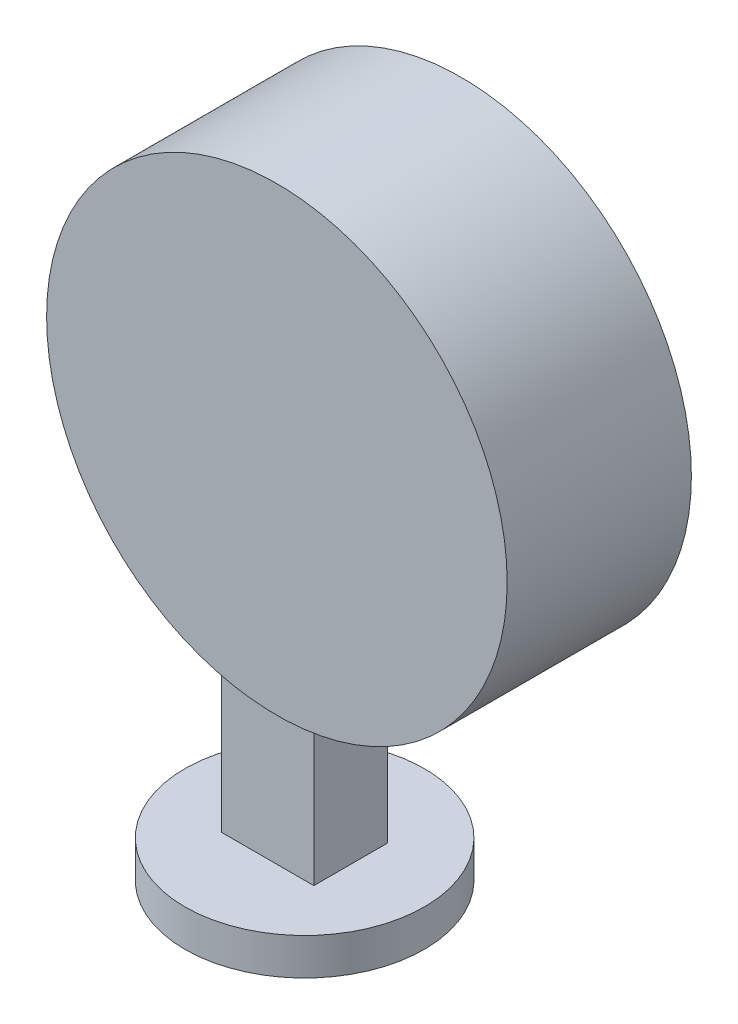
ISO-10303-21;
HEADER;
FILE_DESCRIPTION(('STEP AP214'),'2;1');
FILE_NAME('part.step','',(''),(''),'','','');
FILE_SCHEMA(('AUTOMOTIVE_DESIGN { 1 0 10303 214 1 1 1 1 }'));
ENDSEC;
DATA;
#1=APPLICATION_CONTEXT('core data for automotive mechanical design processes');
#2=APPLICATION_PROTOCOL_DEFINITION('international standard','automotive_design',2000,#1);
#3=PRODUCT_CONTEXT('',#1,'mechanical');
#4=PRODUCT('Part','Part','',(#3));
#5=PRODUCT_RELATED_PRODUCT_CATEGORY('part','',(#4));
#6=PRODUCT_DEFINITION_FORMATION('','',#4);
#7=PRODUCT_DEFINITION_CONTEXT('part definition',#1,'design');
#8=PRODUCT_DEFINITION('design','',#6,#7);
#9=PRODUCT_DEFINITION_SHAPE('','',#8);
#10=(LENGTH_UNIT() NAMED_UNIT(*) SI_UNIT(.MILLI.,.METRE.));
#11=(NAMED_UNIT(*) PLANE_ANGLE_UNIT() SI_UNIT($,.RADIAN.));
#12=(NAMED_UNIT(*) SI_UNIT($,.STERADIAN.) SOLID_ANGLE_UNIT());
#13=UNCERTAINTY_MEASURE_WITH_UNIT(LENGTH_MEASURE(1.E-05),#10,'distance_accuracy_value','');
#14=(GEOMETRIC_REPRESENTATION_CONTEXT(3) GLOBAL_UNCERTAINTY_ASSIGNED_CONTEXT((#13)) GLOBAL_UNIT_ASSIGNED_CONTEXT((#10,
#11,#12)) REPRESENTATION_CONTEXT('',''));
#15=CARTESIAN_POINT('',(0.,0.,0.));
#16=DIRECTION('',(0.,0.,1.));
#17=DIRECTION('',(1.,0.,0.));
#18=AXIS2_PLACEMENT_3D('',#15,#16,#17);
#19=CARTESIAN_POINT('',(0.,2.,0.));
#20=DIRECTION('',(0.,1.,0.));
#21=DIRECTION('',(0.,0.,1.));
#22=AXIS2_PLACEMENT_3D('',#19,#20,#21);
#23=PLANE('',#22);
#24=CARTESIAN_POINT('',(0.,2.,0.));
#25=DIRECTION('',(0.,1.,0.));
#26=DIRECTION('',(0.,0.,1.));
#27=AXIS2_PLACEMENT_3D('',#24,#25,#26);
#28=CIRCLE('',#27,6.5);
#29=CARTESIAN_POINT('',(0.,2.,6.5));
#30=VERTEX_POINT('',#29);
#31=EDGE_CURVE('E50',#30,#30,#28,.T.);
#32=ORIENTED_EDGE('',*,*,#31,.T.);
#33=EDGE_LOOP('',(#32));
#34=FACE_BOUND('',#33,.T.);
#35=DIRECTION('',(1.,0.,0.));
#36=VECTOR('',#35,1.);
#37=CARTESIAN_POINT('',(-2.5,2.,-2.));
#38=LINE('',#37,#36);
#39=CARTESIAN_POINT('',(-2.5,2.,-2.));
#40=VERTEX_POINT('',#39);
#41=CARTESIAN_POINT('',(2.5,2.,-2.));
#42=VERTEX_POINT('',#41);
#43=EDGE_CURVE('E104',#40,#42,#38,.T.);
#44=ORIENTED_EDGE('',*,*,#43,.T.);
#45=DIRECTION('',(0.,0.,1.));
#46=VECTOR('',#45,1.);
#47=CARTESIAN_POINT('',(2.5,2.,-2.));
#48=LINE('',#47,#46);
#49=CARTESIAN_POINT('',(2.5,2.,2.));
#50=VERTEX_POINT('',#49);
#51=EDGE_CURVE('E118',#42,#50,#48,.T.);
#52=ORIENTED_EDGE('',*,*,#51,.T.);
#53=DIRECTION('',(1.,0.,0.));
#54=VECTOR('',#53,1.);
#55=CARTESIAN_POINT('',(-2.5,2.,2.));
#56=LINE('',#55,#54);
#57=CARTESIAN_POINT('',(-2.5,2.,2.));
#58=VERTEX_POINT('',#57);
#59=EDGE_CURVE('E97',#58,#50,#56,.T.);
#60=ORIENTED_EDGE('',*,*,#59,.F.);
#61=DIRECTION('',(0.,0.,1.));
#62=VECTOR('',#61,1.);
#63=CARTESIAN_POINT('',(-2.5,2.,-2.));
#64=LINE('',#63,#62);
#65=EDGE_CURVE('E119',#40,#58,#64,.T.);
#66=ORIENTED_EDGE('',*,*,#65,.F.);
#67=EDGE_LOOP('',(#44,#52,#60,#66));
#68=FACE_BOUND('',#67,.T.);
#69=ADVANCED_FACE('F41',(#34,#68),#23,.T.);
#70=CARTESIAN_POINT('',(0.,2.,0.));
#71=DIRECTION('',(0.,-1.,0.));
#72=DIRECTION('',(0.,0.,-1.));
#73=AXIS2_PLACEMENT_3D('',#70,#71,#72);
#74=CYLINDRICAL_SURFACE('',#73,6.5);
#75=ORIENTED_EDGE('',*,*,#31,.F.);
#76=EDGE_LOOP('',(#75));
#77=FACE_BOUND('',#76,.T.);
#78=CARTESIAN_POINT('',(0.,0.,0.));
#79=DIRECTION('',(0.,1.,0.));
#80=DIRECTION('',(0.,0.,1.));
#81=AXIS2_PLACEMENT_3D('',#78,#79,#80);
#82=CIRCLE('',#81,6.5);
#83=CARTESIAN_POINT('',(0.,0.,6.5));
#84=VERTEX_POINT('',#83);
#85=EDGE_CURVE('E123',#84,#84,#82,.T.);
#86=ORIENTED_EDGE('',*,*,#85,.T.);
#87=EDGE_LOOP('',(#86));
#88=FACE_BOUND('',#87,.T.);
#89=ADVANCED_FACE('F43',(#77,#88),#74,.T.);
#90=CARTESIAN_POINT('',(0.,0.,0.));
#91=DIRECTION('',(0.,1.,0.));
#92=DIRECTION('',(0.,0.,1.));
#93=AXIS2_PLACEMENT_3D('',#90,#91,#92);
#94=PLANE('',#93);
#95=ORIENTED_EDGE('',*,*,#85,.F.);
#96=EDGE_LOOP('',(#95));
#97=FACE_BOUND('',#96,.T.);
#98=ADVANCED_FACE('F133',(#97),#94,.F.);
#99=CARTESIAN_POINT('',(-2.5,2.,-2.));
#100=DIRECTION('',(-1.,0.,0.));
#101=DIRECTION('',(0.,-1.,0.));
#102=AXIS2_PLACEMENT_3D('',#99,#100,#101);
#103=PLANE('',#102);
#104=DIRECTION('',(0.,0.,1.));
#105=VECTOR('',#104,1.);
#106=CARTESIAN_POINT('',(-2.5,13.5309676686024,-5.));
#107=LINE('',#106,#105);
#108=CARTESIAN_POINT('',(-2.5,13.5309676686024,-2.));
#109=VERTEX_POINT('',#108);
#110=CARTESIAN_POINT('',(-2.5,13.5309676686024,2.));
#111=VERTEX_POINT('',#110);
#112=EDGE_CURVE('E57',#109,#111,#107,.T.);
#113=ORIENTED_EDGE('',*,*,#112,.F.);
#114=DIRECTION('',(0.,-1.,0.));
#115=VECTOR('',#114,1.);
#116=CARTESIAN_POINT('',(-2.5,2.,-2.));
#117=LINE('',#116,#115);
#118=EDGE_CURVE('E115',#109,#40,#117,.T.);
#119=ORIENTED_EDGE('',*,*,#118,.T.);
#120=ORIENTED_EDGE('',*,*,#65,.T.);
#121=DIRECTION('',(0.,-1.,0.));
#122=VECTOR('',#121,1.);
#123=CARTESIAN_POINT('',(-2.5,2.,2.));
#124=LINE('',#123,#122);
#125=EDGE_CURVE('E100',#111,#58,#124,.T.);
#126=ORIENTED_EDGE('',*,*,#125,.F.);
#127=EDGE_LOOP('',(#113,#119,#120,#126));
#128=FACE_BOUND('',#127,.T.);
#129=ADVANCED_FACE('F135',(#128),#103,.T.);
#130=CARTESIAN_POINT('',(2.5,2.,-2.));
#131=DIRECTION('',(1.,0.,0.));
#132=DIRECTION('',(0.,1.,0.));
#133=AXIS2_PLACEMENT_3D('',#130,#131,#132);
#134=PLANE('',#133);
#135=DIRECTION('',(0.,0.,1.));
#136=VECTOR('',#135,1.);
#137=CARTESIAN_POINT('',(2.5,12.0395993805438,-5.));
#138=LINE('',#137,#136);
#139=CARTESIAN_POINT('',(2.5,12.0395993805438,2.));
#140=VERTEX_POINT('',#139);
#141=CARTESIAN_POINT('',(2.5,12.0395993805438,-2.));
#142=VERTEX_POINT('',#141);
#143=EDGE_CURVE('E84',#140,#142,#138,.F.);
#144=ORIENTED_EDGE('',*,*,#143,.F.);
#145=DIRECTION('',(0.,1.,0.));
#146=VECTOR('',#145,1.);
#147=CARTESIAN_POINT('',(2.5,2.,2.));
#148=LINE('',#147,#146);
#149=EDGE_CURVE('E90',#50,#140,#148,.T.);
#150=ORIENTED_EDGE('',*,*,#149,.F.);
#151=ORIENTED_EDGE('',*,*,#51,.F.);
#152=DIRECTION('',(0.,1.,0.));
#153=VECTOR('',#152,1.);
#154=CARTESIAN_POINT('',(2.5,2.,-2.));
#155=LINE('',#154,#153);
#156=EDGE_CURVE('E64',#42,#142,#155,.T.);
#157=ORIENTED_EDGE('',*,*,#156,.T.);
#158=EDGE_LOOP('',(#144,#150,#151,#157));
#159=FACE_BOUND('',#158,.T.);
#160=ADVANCED_FACE('F89',(#159),#134,.T.);
#161=CARTESIAN_POINT('',(3.49419133100988,21.0058086689901,-2.));
#162=DIRECTION('',(0.,0.,-1.));
#163=DIRECTION('',(-1.,0.,0.));
#164=AXIS2_PLACEMENT_3D('',#161,#162,#163);
#165=PLANE('',#164);
#166=CARTESIAN_POINT('',(3.49419133100986,24.5,-2.));
#167=DIRECTION('',(0.,0.,-1.));
#168=DIRECTION('',(-1.,0.,0.));
#169=AXIS2_PLACEMENT_3D('',#166,#167,#168);
#170=CIRCLE('',#169,12.5);
#171=EDGE_CURVE('E106',#142,#109,#170,.T.);
#172=ORIENTED_EDGE('',*,*,#171,.F.);
#173=ORIENTED_EDGE('',*,*,#156,.F.);
#174=ORIENTED_EDGE('',*,*,#43,.F.);
#175=ORIENTED_EDGE('',*,*,#118,.F.);
#176=EDGE_LOOP('',(#172,#173,#174,#175));
#177=FACE_BOUND('',#176,.T.);
#178=ADVANCED_FACE('F151',(#177),#165,.T.);
#179=CARTESIAN_POINT('',(3.49419133100988,21.0058086689901,2.));
#180=DIRECTION('',(0.,0.,-1.));
#181=DIRECTION('',(-1.,0.,0.));
#182=AXIS2_PLACEMENT_3D('',#179,#180,#181);
#183=PLANE('',#182);
#184=ORIENTED_EDGE('',*,*,#149,.T.);
#185=CARTESIAN_POINT('',(3.49419133100986,24.5,2.));
#186=DIRECTION('',(0.,0.,-1.));
#187=DIRECTION('',(-1.,0.,0.));
#188=AXIS2_PLACEMENT_3D('',#185,#186,#187);
#189=CIRCLE('',#188,12.5);
#190=EDGE_CURVE('E11',#140,#111,#189,.T.);
#191=ORIENTED_EDGE('',*,*,#190,.T.);
#192=ORIENTED_EDGE('',*,*,#125,.T.);
#193=ORIENTED_EDGE('',*,*,#59,.T.);
#194=EDGE_LOOP('',(#184,#191,#192,#193));
#195=FACE_BOUND('',#194,.T.);
#196=ADVANCED_FACE('F95',(#195),#183,.F.);
#197=CARTESIAN_POINT('',(3.49419133100986,24.5,-5.));
#198=DIRECTION('',(0.,0.,1.));
#199=DIRECTION('',(1.,0.,0.));
#200=AXIS2_PLACEMENT_3D('',#197,#198,#199);
#201=CYLINDRICAL_SURFACE('',#200,12.5);
#202=ORIENTED_EDGE('',*,*,#143,.T.);
#203=ORIENTED_EDGE('',*,*,#171,.T.);
#204=ORIENTED_EDGE('',*,*,#112,.T.);
#205=ORIENTED_EDGE('',*,*,#190,.F.);
#206=EDGE_LOOP('',(#202,#203,#204,#205));
#207=FACE_BOUND('',#206,.T.);
#208=CARTESIAN_POINT('',(3.49419133100986,24.5,-5.));
#209=DIRECTION('',(0.,0.,1.));
#210=DIRECTION('',(1.,0.,0.));
#211=AXIS2_PLACEMENT_3D('',#208,#209,#210);
#212=CIRCLE('',#211,12.5);
#213=CARTESIAN_POINT('',(15.9941913310099,24.5,-5.));
#214=VERTEX_POINT('',#213);
#215=EDGE_CURVE('E93',#214,#214,#212,.T.);
#216=ORIENTED_EDGE('',*,*,#215,.T.);
#217=EDGE_LOOP('',(#216));
#218=FACE_BOUND('',#217,.T.);
#219=CARTESIAN_POINT('',(3.49419133100986,24.5,5.));
#220=DIRECTION('',(0.,0.,1.));
#221=DIRECTION('',(1.,0.,0.));
#222=AXIS2_PLACEMENT_3D('',#219,#220,#221);
#223=CIRCLE('',#222,12.5);
#224=CARTESIAN_POINT('',(15.9941913310099,24.5,5.));
#225=VERTEX_POINT('',#224);
#226=EDGE_CURVE('E170',#225,#225,#223,.T.);
#227=ORIENTED_EDGE('',*,*,#226,.F.);
#228=EDGE_LOOP('',(#227));
#229=FACE_BOUND('',#228,.T.);
#230=ADVANCED_FACE('F82',(#207,#218,#229),#201,.T.);
#231=CARTESIAN_POINT('',(3.49419133100986,24.5,-5.));
#232=DIRECTION('',(0.,0.,1.));
#233=DIRECTION('',(1.,0.,0.));
#234=AXIS2_PLACEMENT_3D('',#231,#232,#233);
#235=PLANE('',#234);
#236=ORIENTED_EDGE('',*,*,#215,.F.);
#237=EDGE_LOOP('',(#236));
#238=FACE_BOUND('',#237,.T.);
#239=ADVANCED_FACE('F159',(#238),#235,.F.);
#240=CARTESIAN_POINT('',(3.49419133100986,24.5,5.));
#241=DIRECTION('',(0.,0.,1.));
#242=DIRECTION('',(1.,0.,0.));
#243=AXIS2_PLACEMENT_3D('',#240,#241,#242);
#244=PLANE('',#243);
#245=ORIENTED_EDGE('',*,*,#226,.T.);
#246=EDGE_LOOP('',(#245));
#247=FACE_BOUND('',#246,.T.);
#248=ADVANCED_FACE('F162',(#247),#244,.T.);
#249=CLOSED_SHELL('',(#69,#89,#98,#129,#160,#178,#196,#230,#239,#248));
#250=MANIFOLD_SOLID_BREP('B2',#249);
#251=ADVANCED_BREP_SHAPE_REPRESENTATION('',(#18,#250),#14);
#252=SHAPE_DEFINITION_REPRESENTATION(#9,#251);
ENDSEC;
END-ISO-10303-21;
